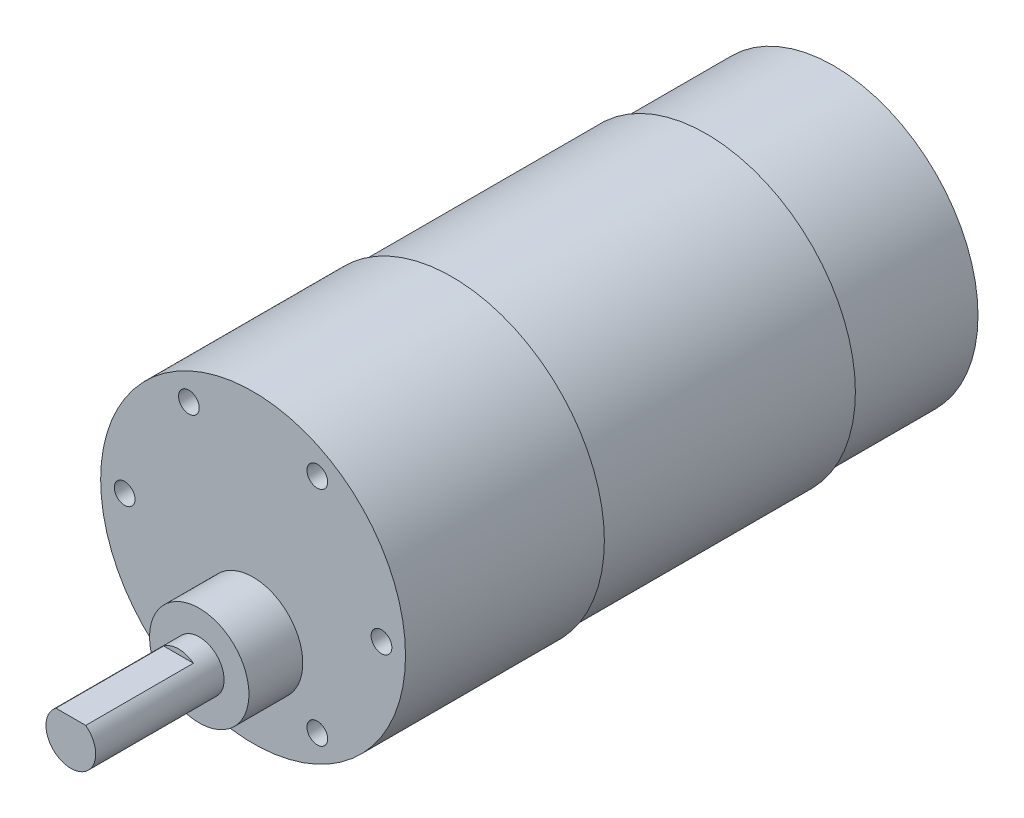
ISO-10303-21;
HEADER;
FILE_DESCRIPTION(('STEP AP214'),'2;1');
FILE_NAME('part.step','',(''),(''),'','','');
FILE_SCHEMA(('AUTOMOTIVE_DESIGN { 1 0 10303 214 1 1 1 1 }'));
ENDSEC;
DATA;
#1=APPLICATION_CONTEXT('core data for automotive mechanical design processes');
#2=APPLICATION_PROTOCOL_DEFINITION('international standard','automotive_design',2000,#1);
#3=PRODUCT_CONTEXT('',#1,'mechanical');
#4=PRODUCT('Part','Part','',(#3));
#5=PRODUCT_RELATED_PRODUCT_CATEGORY('part','',(#4));
#6=PRODUCT_DEFINITION_FORMATION('','',#4);
#7=PRODUCT_DEFINITION_CONTEXT('part definition',#1,'design');
#8=PRODUCT_DEFINITION('design','',#6,#7);
#9=PRODUCT_DEFINITION_SHAPE('','',#8);
#10=(LENGTH_UNIT() NAMED_UNIT(*) SI_UNIT(.MILLI.,.METRE.));
#11=(NAMED_UNIT(*) PLANE_ANGLE_UNIT() SI_UNIT($,.RADIAN.));
#12=(NAMED_UNIT(*) SI_UNIT($,.STERADIAN.) SOLID_ANGLE_UNIT());
#13=UNCERTAINTY_MEASURE_WITH_UNIT(LENGTH_MEASURE(1.E-05),#10,'distance_accuracy_value','');
#14=(GEOMETRIC_REPRESENTATION_CONTEXT(3) GLOBAL_UNCERTAINTY_ASSIGNED_CONTEXT((#13)) GLOBAL_UNIT_ASSIGNED_CONTEXT((#10,
#11,#12)) REPRESENTATION_CONTEXT('',''));
#15=CARTESIAN_POINT('',(0.,0.,0.));
#16=DIRECTION('',(0.,0.,1.));
#17=DIRECTION('',(1.,0.,0.));
#18=AXIS2_PLACEMENT_3D('',#15,#16,#17);
#19=CARTESIAN_POINT('',(0.,0.,15.4));
#20=DIRECTION('',(0.,0.,-1.));
#21=DIRECTION('',(-1.,0.,0.));
#22=AXIS2_PLACEMENT_3D('',#19,#20,#21);
#23=CYLINDRICAL_SURFACE('',#22,17.4);
#24=CARTESIAN_POINT('',(0.,0.,15.4));
#25=DIRECTION('',(0.,0.,1.));
#26=DIRECTION('',(1.,0.,0.));
#27=AXIS2_PLACEMENT_3D('',#24,#25,#26);
#28=CIRCLE('',#27,17.4);
#29=CARTESIAN_POINT('',(-17.4,0.,15.4));
#30=VERTEX_POINT('',#29);
#31=EDGE_CURVE('E11',#30,#30,#28,.T.);
#32=CARTESIAN_POINT('',(0.,0.,0.));
#33=DIRECTION('',(0.,0.,1.));
#34=DIRECTION('',(1.,0.,0.));
#35=AXIS2_PLACEMENT_3D('',#32,#33,#34);
#36=CIRCLE('',#35,17.4);
#37=CARTESIAN_POINT('',(-17.4,0.,0.));
#38=VERTEX_POINT('',#37);
#39=EDGE_CURVE('E36',#38,#38,#36,.T.);
#40=CARTESIAN_POINT('',(-17.4,0.,15.4));
#41=CARTESIAN_POINT('',(-17.4,0.,15.2395833333333));
#42=CARTESIAN_POINT('',(-17.4,0.,15.0791666666667));
#43=CARTESIAN_POINT('',(-17.4,0.,14.7583333333333));
#44=CARTESIAN_POINT('',(-17.4,0.,14.5979166666667));
#45=CARTESIAN_POINT('',(-17.4,0.,14.2770833333333));
#46=CARTESIAN_POINT('',(-17.4,0.,14.1166666666667));
#47=CARTESIAN_POINT('',(-17.4,0.,13.7958333333333));
#48=CARTESIAN_POINT('',(-17.4,0.,13.6354166666667));
#49=CARTESIAN_POINT('',(-17.4,0.,13.3145833333333));
#50=CARTESIAN_POINT('',(-17.4,0.,13.1541666666667));
#51=CARTESIAN_POINT('',(-17.4,0.,12.8333333333333));
#52=CARTESIAN_POINT('',(-17.4,0.,12.6729166666667));
#53=CARTESIAN_POINT('',(-17.4,0.,12.3520833333333));
#54=CARTESIAN_POINT('',(-17.4,0.,12.1916666666667));
#55=CARTESIAN_POINT('',(-17.4,0.,11.8708333333333));
#56=CARTESIAN_POINT('',(-17.4,0.,11.7104166666667));
#57=CARTESIAN_POINT('',(-17.4,0.,11.3895833333333));
#58=CARTESIAN_POINT('',(-17.4,0.,11.2291666666667));
#59=CARTESIAN_POINT('',(-17.4,0.,10.9083333333333));
#60=CARTESIAN_POINT('',(-17.4,0.,10.7479166666667));
#61=CARTESIAN_POINT('',(-17.4,0.,10.4270833333333));
#62=CARTESIAN_POINT('',(-17.4,0.,10.2666666666667));
#63=CARTESIAN_POINT('',(-17.4,0.,9.94583333333333));
#64=CARTESIAN_POINT('',(-17.4,0.,9.78541666666666));
#65=CARTESIAN_POINT('',(-17.4,0.,9.46458333333333));
#66=CARTESIAN_POINT('',(-17.4,0.,9.30416666666667));
#67=CARTESIAN_POINT('',(-17.4,0.,8.98333333333333));
#68=CARTESIAN_POINT('',(-17.4,0.,8.82291666666666));
#69=CARTESIAN_POINT('',(-17.4,0.,8.50208333333333));
#70=CARTESIAN_POINT('',(-17.4,0.,8.34166666666666));
#71=CARTESIAN_POINT('',(-17.4,0.,8.02083333333333));
#72=CARTESIAN_POINT('',(-17.4,0.,7.86041666666666));
#73=CARTESIAN_POINT('',(-17.4,0.,7.53958333333333));
#74=CARTESIAN_POINT('',(-17.4,0.,7.37916666666667));
#75=CARTESIAN_POINT('',(-17.4,0.,7.05833333333333));
#76=CARTESIAN_POINT('',(-17.4,0.,6.89791666666667));
#77=CARTESIAN_POINT('',(-17.4,0.,6.57708333333333));
#78=CARTESIAN_POINT('',(-17.4,0.,6.41666666666667));
#79=CARTESIAN_POINT('',(-17.4,0.,6.09583333333333));
#80=CARTESIAN_POINT('',(-17.4,0.,5.93541666666667));
#81=CARTESIAN_POINT('',(-17.4,0.,5.61458333333333));
#82=CARTESIAN_POINT('',(-17.4,0.,5.45416666666667));
#83=CARTESIAN_POINT('',(-17.4,0.,5.13333333333333));
#84=CARTESIAN_POINT('',(-17.4,0.,4.97291666666667));
#85=CARTESIAN_POINT('',(-17.4,0.,4.65208333333333));
#86=CARTESIAN_POINT('',(-17.4,0.,4.49166666666667));
#87=CARTESIAN_POINT('',(-17.4,0.,4.17083333333333));
#88=CARTESIAN_POINT('',(-17.4,0.,4.01041666666667));
#89=CARTESIAN_POINT('',(-17.4,0.,3.68958333333333));
#90=CARTESIAN_POINT('',(-17.4,0.,3.52916666666667));
#91=CARTESIAN_POINT('',(-17.4,0.,3.20833333333333));
#92=CARTESIAN_POINT('',(-17.4,0.,3.04791666666667));
#93=CARTESIAN_POINT('',(-17.4,0.,2.72708333333333));
#94=CARTESIAN_POINT('',(-17.4,0.,2.56666666666667));
#95=CARTESIAN_POINT('',(-17.4,0.,2.24583333333333));
#96=CARTESIAN_POINT('',(-17.4,0.,2.08541666666666));
#97=CARTESIAN_POINT('',(-17.4,0.,1.76458333333333));
#98=CARTESIAN_POINT('',(-17.4,0.,1.60416666666667));
#99=CARTESIAN_POINT('',(-17.4,0.,1.28333333333333));
#100=CARTESIAN_POINT('',(-17.4,0.,1.12291666666666));
#101=CARTESIAN_POINT('',(-17.4,0.,0.802083333333332));
#102=CARTESIAN_POINT('',(-17.4,0.,0.641666666666665));
#103=CARTESIAN_POINT('',(-17.4,0.,0.320833333333332));
#104=CARTESIAN_POINT('',(-17.4,0.,0.160416666666665));
#105=CARTESIAN_POINT('',(-17.4,0.,0.));
#106=B_SPLINE_CURVE_WITH_KNOTS('',3,(#40,#41,#42,#43,#44,#45,#46,#47,#48,#49,#50,#51,#52,#53,
#54,#55,#56,#57,#58,#59,#60,#61,#62,#63,#64,#65,#66,#67,#68,#69,#70,#71,#72,#73,#74,#75,#76,#77,
#78,#79,#80,#81,#82,#83,#84,#85,#86,#87,#88,#89,#90,#91,#92,#93,#94,#95,#96,#97,#98,#99,#100,
#101,#102,#103,#104,#105),.UNSPECIFIED.,.F.,.F.,(4,2,2,2,2,2,2,2,2,2,2,2,2,2,2,2,2,2,2,2,2,2,2,
2,2,2,2,2,2,2,2,2,4),(0.,0.481250000000001,0.962500000000002,1.44375,1.925,2.40625,2.8875,
3.36875,3.85,4.33125,4.8125,5.29375,5.775,6.25625,6.7375,7.21875,7.7,8.18125,8.6625,9.14375,
9.625,10.10625,10.5875,11.06875,11.55,12.03125,12.5125,12.99375,13.475,13.95625,14.4375,
14.91875,15.4),.UNSPECIFIED.);
#107=EDGE_CURVE('BSEAM33',#30,#38,#106,.T.);
#108=ORIENTED_EDGE('',*,*,#31,.F.);
#109=ORIENTED_EDGE('',*,*,#39,.T.);
#110=ORIENTED_EDGE('',*,*,#107,.T.);
#111=ORIENTED_EDGE('',*,*,#107,.F.);
#112=EDGE_LOOP('',(#108,#110,#109,#111));
#113=FACE_BOUND('',#112,.T.);
#114=ADVANCED_FACE('F33',(#113),#23,.T.);
#115=CARTESIAN_POINT('',(0.,0.,0.));
#116=DIRECTION('',(0.,0.,1.));
#117=DIRECTION('',(1.,0.,0.));
#118=AXIS2_PLACEMENT_3D('',#115,#116,#117);
#119=PLANE('',#118);
#120=ORIENTED_EDGE('',*,*,#39,.F.);
#121=EDGE_LOOP('',(#120));
#122=FACE_BOUND('',#121,.T.);
#123=ADVANCED_FACE('F112',(#122),#119,.F.);
#124=CARTESIAN_POINT('',(0.,0.,46.1));
#125=DIRECTION('',(0.,0.,-1.));
#126=DIRECTION('',(-1.,0.,0.));
#127=AXIS2_PLACEMENT_3D('',#124,#125,#126);
#128=CYLINDRICAL_SURFACE('',#127,18.);
#129=CARTESIAN_POINT('',(0.,0.,46.1));
#130=DIRECTION('',(0.,0.,1.));
#131=DIRECTION('',(1.,0.,0.));
#132=AXIS2_PLACEMENT_3D('',#129,#130,#131);
#133=CIRCLE('',#132,18.);
#134=CARTESIAN_POINT('',(18.,0.,46.1));
#135=VERTEX_POINT('',#134);
#136=EDGE_CURVE('E92',#135,#135,#133,.T.);
#137=ORIENTED_EDGE('',*,*,#136,.F.);
#138=EDGE_LOOP('',(#137));
#139=FACE_BOUND('',#138,.T.);
#140=CARTESIAN_POINT('',(0.,0.,15.4));
#141=DIRECTION('',(0.,0.,1.));
#142=DIRECTION('',(1.,0.,0.));
#143=AXIS2_PLACEMENT_3D('',#140,#141,#142);
#144=CIRCLE('',#143,18.);
#145=CARTESIAN_POINT('',(18.,0.,15.4));
#146=VERTEX_POINT('',#145);
#147=EDGE_CURVE('E89',#146,#146,#144,.T.);
#148=ORIENTED_EDGE('',*,*,#147,.T.);
#149=EDGE_LOOP('',(#148));
#150=FACE_BOUND('',#149,.T.);
#151=ADVANCED_FACE('F98',(#139,#150),#128,.T.);
#152=CARTESIAN_POINT('',(0.,0.,15.4));
#153=DIRECTION('',(0.,0.,1.));
#154=DIRECTION('',(1.,0.,0.));
#155=AXIS2_PLACEMENT_3D('',#152,#153,#154);
#156=PLANE('',#155);
#157=ORIENTED_EDGE('',*,*,#31,.T.);
#158=EDGE_LOOP('',(#157));
#159=FACE_BOUND('',#158,.T.);
#160=ORIENTED_EDGE('',*,*,#147,.F.);
#161=EDGE_LOOP('',(#160));
#162=FACE_BOUND('',#161,.T.);
#163=ADVANCED_FACE('F100',(#159,#162),#156,.F.);
#164=CARTESIAN_POINT('',(0.,0.,70.1));
#165=DIRECTION('',(0.,0.,-1.));
#166=DIRECTION('',(-1.,0.,0.));
#167=AXIS2_PLACEMENT_3D('',#164,#165,#166);
#168=CYLINDRICAL_SURFACE('',#167,18.4);
#169=CARTESIAN_POINT('',(0.,0.,70.1));
#170=DIRECTION('',(0.,0.,1.));
#171=DIRECTION('',(1.,0.,0.));
#172=AXIS2_PLACEMENT_3D('',#169,#170,#171);
#173=CIRCLE('',#172,18.4);
#174=CARTESIAN_POINT('',(18.4,0.,70.1));
#175=VERTEX_POINT('',#174);
#176=EDGE_CURVE('E86',#175,#175,#173,.T.);
#177=ORIENTED_EDGE('',*,*,#176,.F.);
#178=EDGE_LOOP('',(#177));
#179=FACE_BOUND('',#178,.T.);
#180=CARTESIAN_POINT('',(0.,0.,46.1));
#181=DIRECTION('',(0.,0.,1.));
#182=DIRECTION('',(1.,0.,0.));
#183=AXIS2_PLACEMENT_3D('',#180,#181,#182);
#184=CIRCLE('',#183,18.4);
#185=CARTESIAN_POINT('',(18.4,0.,46.1));
#186=VERTEX_POINT('',#185);
#187=EDGE_CURVE('E84',#186,#186,#184,.T.);
#188=ORIENTED_EDGE('',*,*,#187,.T.);
#189=EDGE_LOOP('',(#188));
#190=FACE_BOUND('',#189,.T.);
#191=ADVANCED_FACE('F102',(#179,#190),#168,.T.);
#192=CARTESIAN_POINT('',(0.,0.,70.1));
#193=DIRECTION('',(0.,0.,1.));
#194=DIRECTION('',(1.,0.,0.));
#195=AXIS2_PLACEMENT_3D('',#192,#193,#194);
#196=PLANE('',#195);
#197=CARTESIAN_POINT('',(-15.5,0.,70.1));
#198=DIRECTION('',(0.,0.,1.));
#199=DIRECTION('',(1.,0.,0.));
#200=AXIS2_PLACEMENT_3D('',#197,#198,#199);
#201=CIRCLE('',#200,1.25);
#202=CARTESIAN_POINT('',(-14.25,0.,70.1));
#203=VERTEX_POINT('',#202);
#204=EDGE_CURVE('E344',#203,#203,#201,.T.);
#205=ORIENTED_EDGE('',*,*,#204,.F.);
#206=EDGE_LOOP('',(#205));
#207=FACE_BOUND('',#206,.T.);
#208=CARTESIAN_POINT('',(-7.74999999999997,13.4233937586588,70.1));
#209=DIRECTION('',(0.,0.,1.));
#210=DIRECTION('',(1.,0.,0.));
#211=AXIS2_PLACEMENT_3D('',#208,#209,#210);
#212=CIRCLE('',#211,1.25);
#213=CARTESIAN_POINT('',(-6.49999999999997,13.4233937586588,70.1));
#214=VERTEX_POINT('',#213);
#215=EDGE_CURVE('E346',#214,#214,#212,.T.);
#216=ORIENTED_EDGE('',*,*,#215,.F.);
#217=EDGE_LOOP('',(#216));
#218=FACE_BOUND('',#217,.T.);
#219=CARTESIAN_POINT('',(7.75000000000006,13.4233937586588,70.1));
#220=DIRECTION('',(0.,0.,1.));
#221=DIRECTION('',(1.,0.,0.));
#222=AXIS2_PLACEMENT_3D('',#219,#220,#221);
#223=CIRCLE('',#222,1.25);
#224=CARTESIAN_POINT('',(9.00000000000006,13.4233937586588,70.1));
#225=VERTEX_POINT('',#224);
#226=EDGE_CURVE('E354',#225,#225,#223,.T.);
#227=ORIENTED_EDGE('',*,*,#226,.F.);
#228=EDGE_LOOP('',(#227));
#229=FACE_BOUND('',#228,.T.);
#230=CARTESIAN_POINT('',(15.5,-1.08235921504137E-13,70.1));
#231=DIRECTION('',(0.,0.,1.));
#232=DIRECTION('',(1.,0.,0.));
#233=AXIS2_PLACEMENT_3D('',#230,#231,#232);
#234=CIRCLE('',#233,1.25);
#235=CARTESIAN_POINT('',(16.75,-1.08235921504137E-13,70.1));
#236=VERTEX_POINT('',#235);
#237=EDGE_CURVE('E360',#236,#236,#234,.T.);
#238=ORIENTED_EDGE('',*,*,#237,.F.);
#239=EDGE_LOOP('',(#238));
#240=FACE_BOUND('',#239,.T.);
#241=CARTESIAN_POINT('',(7.74999999999987,-13.4233937586589,70.1));
#242=DIRECTION('',(0.,0.,1.));
#243=DIRECTION('',(1.,0.,0.));
#244=AXIS2_PLACEMENT_3D('',#241,#242,#243);
#245=CIRCLE('',#244,1.25);
#246=CARTESIAN_POINT('',(8.99999999999987,-13.4233937586589,70.1));
#247=VERTEX_POINT('',#246);
#248=EDGE_CURVE('E366',#247,#247,#245,.T.);
#249=ORIENTED_EDGE('',*,*,#248,.F.);
#250=EDGE_LOOP('',(#249));
#251=FACE_BOUND('',#250,.T.);
#252=CARTESIAN_POINT('',(-7.75000000000016,-13.4233937586587,70.1));
#253=DIRECTION('',(0.,0.,1.));
#254=DIRECTION('',(1.,0.,0.));
#255=AXIS2_PLACEMENT_3D('',#252,#253,#254);
#256=CIRCLE('',#255,1.25);
#257=CARTESIAN_POINT('',(-6.50000000000016,-13.4233937586587,70.1));
#258=VERTEX_POINT('',#257);
#259=EDGE_CURVE('E372',#258,#258,#256,.T.);
#260=ORIENTED_EDGE('',*,*,#259,.F.);
#261=EDGE_LOOP('',(#260));
#262=FACE_BOUND('',#261,.T.);
#263=CARTESIAN_POINT('',(0.,-7.,70.1));
#264=DIRECTION('',(0.,0.,1.));
#265=DIRECTION('',(1.,0.,0.));
#266=AXIS2_PLACEMENT_3D('',#263,#264,#265);
#267=CIRCLE('',#266,6.);
#268=CARTESIAN_POINT('',(-6.,-7.,70.1));
#269=VERTEX_POINT('',#268);
#270=EDGE_CURVE('E74',#269,#269,#267,.T.);
#271=ORIENTED_EDGE('',*,*,#270,.F.);
#272=EDGE_LOOP('',(#271));
#273=FACE_BOUND('',#272,.T.);
#274=ORIENTED_EDGE('',*,*,#176,.T.);
#275=EDGE_LOOP('',(#274));
#276=FACE_BOUND('',#275,.T.);
#277=ADVANCED_FACE('F109',(#207,#218,#229,#240,#251,#262,#273,#276),#196,.T.);
#278=CARTESIAN_POINT('',(0.,0.,46.1));
#279=DIRECTION('',(0.,0.,1.));
#280=DIRECTION('',(1.,0.,0.));
#281=AXIS2_PLACEMENT_3D('',#278,#279,#280);
#282=PLANE('',#281);
#283=ORIENTED_EDGE('',*,*,#136,.T.);
#284=EDGE_LOOP('',(#283));
#285=FACE_BOUND('',#284,.T.);
#286=ORIENTED_EDGE('',*,*,#187,.F.);
#287=EDGE_LOOP('',(#286));
#288=FACE_BOUND('',#287,.T.);
#289=ADVANCED_FACE('F148',(#285,#288),#282,.F.);
#290=CARTESIAN_POINT('',(0.,-7.,76.6));
#291=DIRECTION('',(0.,0.,-1.));
#292=DIRECTION('',(-1.,0.,0.));
#293=AXIS2_PLACEMENT_3D('',#290,#291,#292);
#294=CYLINDRICAL_SURFACE('',#293,6.);
#295=CARTESIAN_POINT('',(0.,-7.,76.6));
#296=DIRECTION('',(0.,0.,1.));
#297=DIRECTION('',(1.,0.,0.));
#298=AXIS2_PLACEMENT_3D('',#295,#296,#297);
#299=CIRCLE('',#298,6.);
#300=CARTESIAN_POINT('',(-6.,-7.,76.6));
#301=VERTEX_POINT('',#300);
#302=EDGE_CURVE('E77',#301,#301,#299,.T.);
#303=CARTESIAN_POINT('',(-6.,-7.,76.6));
#304=CARTESIAN_POINT('',(-6.,-7.,76.5322916666667));
#305=CARTESIAN_POINT('',(-6.,-7.,76.4645833333333));
#306=CARTESIAN_POINT('',(-6.,-7.,76.3291666666667));
#307=CARTESIAN_POINT('',(-6.,-7.,76.2614583333333));
#308=CARTESIAN_POINT('',(-6.,-7.,76.1260416666667));
#309=CARTESIAN_POINT('',(-6.,-7.,76.0583333333333));
#310=CARTESIAN_POINT('',(-6.,-7.,75.9229166666667));
#311=CARTESIAN_POINT('',(-6.,-7.,75.8552083333333));
#312=CARTESIAN_POINT('',(-6.,-7.,75.7197916666667));
#313=CARTESIAN_POINT('',(-6.,-7.,75.6520833333333));
#314=CARTESIAN_POINT('',(-6.,-7.,75.5166666666667));
#315=CARTESIAN_POINT('',(-6.,-7.,75.4489583333333));
#316=CARTESIAN_POINT('',(-6.,-7.,75.3135416666667));
#317=CARTESIAN_POINT('',(-6.,-7.,75.2458333333333));
#318=CARTESIAN_POINT('',(-6.,-7.,75.1104166666667));
#319=CARTESIAN_POINT('',(-6.,-7.,75.0427083333333));
#320=CARTESIAN_POINT('',(-6.,-7.,74.9072916666667));
#321=CARTESIAN_POINT('',(-6.,-7.,74.8395833333333));
#322=CARTESIAN_POINT('',(-6.,-7.,74.7041666666667));
#323=CARTESIAN_POINT('',(-6.,-7.,74.6364583333333));
#324=CARTESIAN_POINT('',(-6.,-7.,74.5010416666667));
#325=CARTESIAN_POINT('',(-6.,-7.,74.4333333333333));
#326=CARTESIAN_POINT('',(-6.,-7.,74.2979166666667));
#327=CARTESIAN_POINT('',(-6.,-7.,74.2302083333333));
#328=CARTESIAN_POINT('',(-6.,-7.,74.0947916666667));
#329=CARTESIAN_POINT('',(-6.,-7.,74.0270833333333));
#330=CARTESIAN_POINT('',(-6.,-7.,73.8916666666667));
#331=CARTESIAN_POINT('',(-6.,-7.,73.8239583333333));
#332=CARTESIAN_POINT('',(-6.,-7.,73.6885416666667));
#333=CARTESIAN_POINT('',(-6.,-7.,73.6208333333333));
#334=CARTESIAN_POINT('',(-6.,-7.,73.4854166666667));
#335=CARTESIAN_POINT('',(-6.,-7.,73.4177083333333));
#336=CARTESIAN_POINT('',(-6.,-7.,73.2822916666667));
#337=CARTESIAN_POINT('',(-6.,-7.,73.2145833333333));
#338=CARTESIAN_POINT('',(-6.,-7.,73.0791666666667));
#339=CARTESIAN_POINT('',(-6.,-7.,73.0114583333333));
#340=CARTESIAN_POINT('',(-6.,-7.,72.8760416666667));
#341=CARTESIAN_POINT('',(-6.,-7.,72.8083333333333));
#342=CARTESIAN_POINT('',(-6.,-7.,72.6729166666667));
#343=CARTESIAN_POINT('',(-6.,-7.,72.6052083333333));
#344=CARTESIAN_POINT('',(-6.,-7.,72.4697916666667));
#345=CARTESIAN_POINT('',(-6.,-7.,72.4020833333333));
#346=CARTESIAN_POINT('',(-6.,-7.,72.2666666666667));
#347=CARTESIAN_POINT('',(-6.,-7.,72.1989583333333));
#348=CARTESIAN_POINT('',(-6.,-7.,72.0635416666667));
#349=CARTESIAN_POINT('',(-6.,-7.,71.9958333333333));
#350=CARTESIAN_POINT('',(-6.,-7.,71.8604166666667));
#351=CARTESIAN_POINT('',(-6.,-7.,71.7927083333333));
#352=CARTESIAN_POINT('',(-6.,-7.,71.6572916666667));
#353=CARTESIAN_POINT('',(-6.,-7.,71.5895833333333));
#354=CARTESIAN_POINT('',(-6.,-7.,71.4541666666667));
#355=CARTESIAN_POINT('',(-6.,-7.,71.3864583333333));
#356=CARTESIAN_POINT('',(-6.,-7.,71.2510416666667));
#357=CARTESIAN_POINT('',(-6.,-7.,71.1833333333333));
#358=CARTESIAN_POINT('',(-6.,-7.,71.0479166666667));
#359=CARTESIAN_POINT('',(-6.,-7.,70.9802083333333));
#360=CARTESIAN_POINT('',(-6.,-7.,70.8447916666667));
#361=CARTESIAN_POINT('',(-6.,-7.,70.7770833333333));
#362=CARTESIAN_POINT('',(-6.,-7.,70.6416666666667));
#363=CARTESIAN_POINT('',(-6.,-7.,70.5739583333333));
#364=CARTESIAN_POINT('',(-6.,-7.,70.4385416666667));
#365=CARTESIAN_POINT('',(-6.,-7.,70.3708333333333));
#366=CARTESIAN_POINT('',(-6.,-7.,70.2354166666667));
#367=CARTESIAN_POINT('',(-6.,-7.,70.1677083333333));
#368=CARTESIAN_POINT('',(-6.,-7.,70.1));
#369=B_SPLINE_CURVE_WITH_KNOTS('',3,(#303,#304,#305,#306,#307,#308,#309,#310,#311,#312,#313,
#314,#315,#316,#317,#318,#319,#320,#321,#322,#323,#324,#325,#326,#327,#328,#329,#330,#331,#332,
#333,#334,#335,#336,#337,#338,#339,#340,#341,#342,#343,#344,#345,#346,#347,#348,#349,#350,#351,
#352,#353,#354,#355,#356,#357,#358,#359,#360,#361,#362,#363,#364,#365,#366,#367,#368),
.UNSPECIFIED.,.F.,.F.,(4,2,2,2,2,2,2,2,2,2,2,2,2,2,2,2,2,2,2,2,2,2,2,2,2,2,2,2,2,2,2,2,4),(0.,
0.203124999999998,0.406249999999997,0.609374999999995,0.812499999999994,1.01562499999999,
1.21874999999999,1.42187499999999,1.625,1.828125,2.03125,2.234375,2.4375,2.64062499999999,
2.84374999999999,3.04687499999999,3.25,3.453125,3.65625,3.859375,4.0625,4.26562499999999,
4.46874999999999,4.67187499999999,4.875,5.078125,5.28125,5.484375,5.6875,5.890625,
6.09374999999999,6.29687499999999,6.50000000000001),.UNSPECIFIED.);
#370=EDGE_CURVE('BSEAM153',#301,#269,#369,.T.);
#371=ORIENTED_EDGE('',*,*,#302,.F.);
#372=ORIENTED_EDGE('',*,*,#270,.T.);
#373=ORIENTED_EDGE('',*,*,#370,.T.);
#374=ORIENTED_EDGE('',*,*,#370,.F.);
#375=EDGE_LOOP('',(#371,#373,#372,#374));
#376=FACE_BOUND('',#375,.T.);
#377=ADVANCED_FACE('F153',(#376),#294,.T.);
#378=CARTESIAN_POINT('',(0.,-7.,76.6));
#379=DIRECTION('',(0.,0.,1.));
#380=DIRECTION('',(1.,0.,0.));
#381=AXIS2_PLACEMENT_3D('',#378,#379,#380);
#382=PLANE('',#381);
#383=CARTESIAN_POINT('',(0.,-7.,76.6));
#384=DIRECTION('',(0.,0.,1.));
#385=DIRECTION('',(1.,0.,0.));
#386=AXIS2_PLACEMENT_3D('',#383,#384,#385);
#387=CIRCLE('',#386,3.);
#388=CARTESIAN_POINT('',(3.,-7.,76.6));
#389=VERTEX_POINT('',#388);
#390=EDGE_CURVE('E71',#389,#389,#387,.T.);
#391=ORIENTED_EDGE('',*,*,#390,.F.);
#392=EDGE_LOOP('',(#391));
#393=FACE_BOUND('',#392,.T.);
#394=ORIENTED_EDGE('',*,*,#302,.T.);
#395=EDGE_LOOP('',(#394));
#396=FACE_BOUND('',#395,.T.);
#397=ADVANCED_FACE('F163',(#393,#396),#382,.T.);
#398=CARTESIAN_POINT('',(0.,-7.,92.1));
#399=DIRECTION('',(0.,0.,-1.));
#400=DIRECTION('',(-1.,0.,0.));
#401=AXIS2_PLACEMENT_3D('',#398,#399,#400);
#402=CYLINDRICAL_SURFACE('',#401,3.);
#403=CARTESIAN_POINT('',(0.,-7.,92.1));
#404=DIRECTION('',(0.,0.,1.));
#405=DIRECTION('',(1.,0.,0.));
#406=AXIS2_PLACEMENT_3D('',#403,#404,#405);
#407=CIRCLE('',#406,3.);
#408=CARTESIAN_POINT('',(-1.8,-4.6,92.1));
#409=VERTEX_POINT('',#408);
#410=CARTESIAN_POINT('',(1.8,-4.6,92.1));
#411=VERTEX_POINT('',#410);
#412=EDGE_CURVE('E70',#409,#411,#407,.T.);
#413=ORIENTED_EDGE('',*,*,#412,.F.);
#414=DIRECTION('',(0.,0.,1.));
#415=VECTOR('',#414,1.);
#416=CARTESIAN_POINT('',(-1.8,-4.6,79.1));
#417=LINE('',#416,#415);
#418=CARTESIAN_POINT('',(-1.8,-4.6,79.1));
#419=VERTEX_POINT('',#418);
#420=EDGE_CURVE('E47',#419,#409,#417,.T.);
#421=ORIENTED_EDGE('',*,*,#420,.F.);
#422=CARTESIAN_POINT('',(0.,-7.00000000000001,79.1));
#423=DIRECTION('',(0.,0.,1.));
#424=DIRECTION('',(-1.,0.,0.));
#425=AXIS2_PLACEMENT_3D('',#422,#423,#424);
#426=CIRCLE('',#425,3.00000000000001);
#427=CARTESIAN_POINT('',(1.8,-4.6,79.1));
#428=VERTEX_POINT('',#427);
#429=EDGE_CURVE('E63',#428,#419,#426,.T.);
#430=ORIENTED_EDGE('',*,*,#429,.F.);
#431=DIRECTION('',(0.,0.,1.));
#432=VECTOR('',#431,1.);
#433=CARTESIAN_POINT('',(1.8,-4.6,79.1));
#434=LINE('',#433,#432);
#435=EDGE_CURVE('E53',#428,#411,#434,.T.);
#436=ORIENTED_EDGE('',*,*,#435,.T.);
#437=EDGE_LOOP('',(#413,#421,#430,#436));
#438=FACE_BOUND('',#437,.T.);
#439=ORIENTED_EDGE('',*,*,#390,.T.);
#440=EDGE_LOOP('',(#439));
#441=FACE_BOUND('',#440,.T.);
#442=ADVANCED_FACE('F68',(#438,#441),#402,.T.);
#443=CARTESIAN_POINT('',(0.,-7.,92.1));
#444=DIRECTION('',(0.,0.,1.));
#445=DIRECTION('',(1.,0.,0.));
#446=AXIS2_PLACEMENT_3D('',#443,#444,#445);
#447=PLANE('',#446);
#448=DIRECTION('',(1.,0.,0.));
#449=VECTOR('',#448,1.);
#450=CARTESIAN_POINT('',(-1.8,-4.6,92.1));
#451=LINE('',#450,#449);
#452=EDGE_CURVE('E58',#409,#411,#451,.T.);
#453=ORIENTED_EDGE('',*,*,#452,.F.);
#454=ORIENTED_EDGE('',*,*,#412,.T.);
#455=EDGE_LOOP('',(#453,#454));
#456=FACE_BOUND('',#455,.T.);
#457=ADVANCED_FACE('F73',(#456),#447,.T.);
#458=CARTESIAN_POINT('',(-1.8,-4.6,79.1));
#459=DIRECTION('',(0.,-1.,0.));
#460=DIRECTION('',(0.,0.,-1.));
#461=AXIS2_PLACEMENT_3D('',#458,#459,#460);
#462=PLANE('',#461);
#463=ORIENTED_EDGE('',*,*,#452,.T.);
#464=ORIENTED_EDGE('',*,*,#435,.F.);
#465=DIRECTION('',(1.,0.,0.));
#466=VECTOR('',#465,1.);
#467=CARTESIAN_POINT('',(-1.8,-4.6,79.1));
#468=LINE('',#467,#466);
#469=EDGE_CURVE('E378',#419,#428,#468,.T.);
#470=ORIENTED_EDGE('',*,*,#469,.F.);
#471=ORIENTED_EDGE('',*,*,#420,.T.);
#472=EDGE_LOOP('',(#463,#464,#470,#471));
#473=FACE_BOUND('',#472,.T.);
#474=ADVANCED_FACE('F59',(#473),#462,.F.);
#475=CARTESIAN_POINT('',(0.,-7.00000000000001,79.1));
#476=DIRECTION('',(0.,0.,-1.));
#477=DIRECTION('',(-1.,0.,0.));
#478=AXIS2_PLACEMENT_3D('',#475,#476,#477);
#479=PLANE('',#478);
#480=ORIENTED_EDGE('',*,*,#429,.T.);
#481=ORIENTED_EDGE('',*,*,#469,.T.);
#482=EDGE_LOOP('',(#480,#481));
#483=FACE_BOUND('',#482,.T.);
#484=ADVANCED_FACE('F198',(#483),#479,.F.);
#485=CARTESIAN_POINT('',(-7.75000000000016,-13.4233937586587,59.34));
#486=DIRECTION('',(0.,0.,-1.));
#487=DIRECTION('',(-1.,0.,0.));
#488=AXIS2_PLACEMENT_3D('',#485,#486,#487);
#489=PLANE('',#488);
#490=CARTESIAN_POINT('',(-7.75000000000016,-13.4233937586587,59.34));
#491=DIRECTION('',(0.,0.,1.));
#492=DIRECTION('',(1.,0.,0.));
#493=AXIS2_PLACEMENT_3D('',#490,#491,#492);
#494=CIRCLE('',#493,1.25);
#495=CARTESIAN_POINT('',(-6.50000000000016,-13.4233937586587,59.34));
#496=VERTEX_POINT('',#495);
#497=EDGE_CURVE('E64',#496,#496,#494,.T.);
#498=ORIENTED_EDGE('',*,*,#497,.T.);
#499=EDGE_LOOP('',(#498));
#500=FACE_BOUND('',#499,.T.);
#501=ADVANCED_FACE('F207',(#500),#489,.F.);
#502=CARTESIAN_POINT('',(-7.75000000000016,-13.4233937586587,70.1));
#503=DIRECTION('',(0.,0.,1.));
#504=DIRECTION('',(1.,0.,0.));
#505=AXIS2_PLACEMENT_3D('',#502,#503,#504);
#506=CYLINDRICAL_SURFACE('',#505,1.25);
#507=ORIENTED_EDGE('',*,*,#497,.F.);
#508=EDGE_LOOP('',(#507));
#509=FACE_BOUND('',#508,.T.);
#510=ORIENTED_EDGE('',*,*,#259,.T.);
#511=EDGE_LOOP('',(#510));
#512=FACE_BOUND('',#511,.T.);
#513=ADVANCED_FACE('F224',(#509,#512),#506,.F.);
#514=CARTESIAN_POINT('',(7.74999999999987,-13.4233937586589,59.34));
#515=DIRECTION('',(0.,0.,-1.));
#516=DIRECTION('',(-1.,0.,0.));
#517=AXIS2_PLACEMENT_3D('',#514,#515,#516);
#518=PLANE('',#517);
#519=CARTESIAN_POINT('',(7.74999999999987,-13.4233937586589,59.34));
#520=DIRECTION('',(0.,0.,1.));
#521=DIRECTION('',(1.,0.,0.));
#522=AXIS2_PLACEMENT_3D('',#519,#520,#521);
#523=CIRCLE('',#522,1.25);
#524=CARTESIAN_POINT('',(8.99999999999987,-13.4233937586589,59.34));
#525=VERTEX_POINT('',#524);
#526=EDGE_CURVE('E369',#525,#525,#523,.T.);
#527=ORIENTED_EDGE('',*,*,#526,.T.);
#528=EDGE_LOOP('',(#527));
#529=FACE_BOUND('',#528,.T.);
#530=ADVANCED_FACE('F234',(#529),#518,.F.);
#531=CARTESIAN_POINT('',(7.74999999999987,-13.4233937586589,70.1));
#532=DIRECTION('',(0.,0.,1.));
#533=DIRECTION('',(1.,0.,0.));
#534=AXIS2_PLACEMENT_3D('',#531,#532,#533);
#535=CYLINDRICAL_SURFACE('',#534,1.25);
#536=ORIENTED_EDGE('',*,*,#526,.F.);
#537=EDGE_LOOP('',(#536));
#538=FACE_BOUND('',#537,.T.);
#539=ORIENTED_EDGE('',*,*,#248,.T.);
#540=EDGE_LOOP('',(#539));
#541=FACE_BOUND('',#540,.T.);
#542=ADVANCED_FACE('F244',(#538,#541),#535,.F.);
#543=CARTESIAN_POINT('',(15.5,-1.08235921504137E-13,59.34));
#544=DIRECTION('',(0.,0.,-1.));
#545=DIRECTION('',(-1.,0.,0.));
#546=AXIS2_PLACEMENT_3D('',#543,#544,#545);
#547=PLANE('',#546);
#548=CARTESIAN_POINT('',(15.5,-1.08235921504137E-13,59.34));
#549=DIRECTION('',(0.,0.,1.));
#550=DIRECTION('',(1.,0.,0.));
#551=AXIS2_PLACEMENT_3D('',#548,#549,#550);
#552=CIRCLE('',#551,1.25);
#553=CARTESIAN_POINT('',(16.75,-1.08235921504137E-13,59.34));
#554=VERTEX_POINT('',#553);
#555=EDGE_CURVE('E363',#554,#554,#552,.T.);
#556=ORIENTED_EDGE('',*,*,#555,.T.);
#557=EDGE_LOOP('',(#556));
#558=FACE_BOUND('',#557,.T.);
#559=ADVANCED_FACE('F254',(#558),#547,.F.);
#560=CARTESIAN_POINT('',(15.5,-1.08235921504137E-13,70.1));
#561=DIRECTION('',(0.,0.,1.));
#562=DIRECTION('',(1.,0.,0.));
#563=AXIS2_PLACEMENT_3D('',#560,#561,#562);
#564=CYLINDRICAL_SURFACE('',#563,1.25);
#565=ORIENTED_EDGE('',*,*,#555,.F.);
#566=EDGE_LOOP('',(#565));
#567=FACE_BOUND('',#566,.T.);
#568=ORIENTED_EDGE('',*,*,#237,.T.);
#569=EDGE_LOOP('',(#568));
#570=FACE_BOUND('',#569,.T.);
#571=ADVANCED_FACE('F264',(#567,#570),#564,.F.);
#572=CARTESIAN_POINT('',(7.75000000000006,13.4233937586588,59.34));
#573=DIRECTION('',(0.,0.,-1.));
#574=DIRECTION('',(-1.,0.,0.));
#575=AXIS2_PLACEMENT_3D('',#572,#573,#574);
#576=PLANE('',#575);
#577=CARTESIAN_POINT('',(7.75000000000006,13.4233937586588,59.34));
#578=DIRECTION('',(0.,0.,1.));
#579=DIRECTION('',(1.,0.,0.));
#580=AXIS2_PLACEMENT_3D('',#577,#578,#579);
#581=CIRCLE('',#580,1.25);
#582=CARTESIAN_POINT('',(9.00000000000006,13.4233937586588,59.34));
#583=VERTEX_POINT('',#582);
#584=EDGE_CURVE('E357',#583,#583,#581,.T.);
#585=ORIENTED_EDGE('',*,*,#584,.T.);
#586=EDGE_LOOP('',(#585));
#587=FACE_BOUND('',#586,.T.);
#588=ADVANCED_FACE('F274',(#587),#576,.F.);
#589=CARTESIAN_POINT('',(7.75000000000006,13.4233937586588,70.1));
#590=DIRECTION('',(0.,0.,1.));
#591=DIRECTION('',(1.,0.,0.));
#592=AXIS2_PLACEMENT_3D('',#589,#590,#591);
#593=CYLINDRICAL_SURFACE('',#592,1.25);
#594=ORIENTED_EDGE('',*,*,#584,.F.);
#595=EDGE_LOOP('',(#594));
#596=FACE_BOUND('',#595,.T.);
#597=ORIENTED_EDGE('',*,*,#226,.T.);
#598=EDGE_LOOP('',(#597));
#599=FACE_BOUND('',#598,.T.);
#600=ADVANCED_FACE('F284',(#596,#599),#593,.F.);
#601=CARTESIAN_POINT('',(-7.74999999999997,13.4233937586588,59.34));
#602=DIRECTION('',(0.,0.,-1.));
#603=DIRECTION('',(-1.,0.,0.));
#604=AXIS2_PLACEMENT_3D('',#601,#602,#603);
#605=PLANE('',#604);
#606=CARTESIAN_POINT('',(-7.74999999999997,13.4233937586588,59.34));
#607=DIRECTION('',(0.,0.,1.));
#608=DIRECTION('',(1.,0.,0.));
#609=AXIS2_PLACEMENT_3D('',#606,#607,#608);
#610=CIRCLE('',#609,1.25);
#611=CARTESIAN_POINT('',(-6.49999999999997,13.4233937586588,59.34));
#612=VERTEX_POINT('',#611);
#613=EDGE_CURVE('E351',#612,#612,#610,.T.);
#614=ORIENTED_EDGE('',*,*,#613,.T.);
#615=EDGE_LOOP('',(#614));
#616=FACE_BOUND('',#615,.T.);
#617=ADVANCED_FACE('F294',(#616),#605,.F.);
#618=CARTESIAN_POINT('',(-7.74999999999997,13.4233937586588,70.1));
#619=DIRECTION('',(0.,0.,1.));
#620=DIRECTION('',(1.,0.,0.));
#621=AXIS2_PLACEMENT_3D('',#618,#619,#620);
#622=CYLINDRICAL_SURFACE('',#621,1.25);
#623=ORIENTED_EDGE('',*,*,#613,.F.);
#624=EDGE_LOOP('',(#623));
#625=FACE_BOUND('',#624,.T.);
#626=ORIENTED_EDGE('',*,*,#215,.T.);
#627=EDGE_LOOP('',(#626));
#628=FACE_BOUND('',#627,.T.);
#629=ADVANCED_FACE('F304',(#625,#628),#622,.F.);
#630=CARTESIAN_POINT('',(-15.5,0.,59.34));
#631=DIRECTION('',(0.,0.,-1.));
#632=DIRECTION('',(-1.,0.,0.));
#633=AXIS2_PLACEMENT_3D('',#630,#631,#632);
#634=PLANE('',#633);
#635=CARTESIAN_POINT('',(-15.5,0.,59.34));
#636=DIRECTION('',(0.,0.,1.));
#637=DIRECTION('',(1.,0.,0.));
#638=AXIS2_PLACEMENT_3D('',#635,#636,#637);
#639=CIRCLE('',#638,1.25);
#640=CARTESIAN_POINT('',(-14.25,0.,59.34));
#641=VERTEX_POINT('',#640);
#642=EDGE_CURVE('E341',#641,#641,#639,.T.);
#643=ORIENTED_EDGE('',*,*,#642,.T.);
#644=EDGE_LOOP('',(#643));
#645=FACE_BOUND('',#644,.T.);
#646=ADVANCED_FACE('F314',(#645),#634,.F.);
#647=CARTESIAN_POINT('',(-15.5,0.,70.1));
#648=DIRECTION('',(0.,0.,1.));
#649=DIRECTION('',(1.,0.,0.));
#650=AXIS2_PLACEMENT_3D('',#647,#648,#649);
#651=CYLINDRICAL_SURFACE('',#650,1.25);
#652=ORIENTED_EDGE('',*,*,#642,.F.);
#653=EDGE_LOOP('',(#652));
#654=FACE_BOUND('',#653,.T.);
#655=ORIENTED_EDGE('',*,*,#204,.T.);
#656=EDGE_LOOP('',(#655));
#657=FACE_BOUND('',#656,.T.);
#658=ADVANCED_FACE('F324',(#654,#657),#651,.F.);
#659=CLOSED_SHELL('',(#114,#123,#151,#163,#191,#277,#289,#377,#397,#442,#457,#474,#484,#501,
#513,#530,#542,#559,#571,#588,#600,#617,#629,#646,#658));
#660=MANIFOLD_SOLID_BREP('B2',#659);
#661=ADVANCED_BREP_SHAPE_REPRESENTATION('',(#18,#660),#14);
#662=SHAPE_DEFINITION_REPRESENTATION(#9,#661);
ENDSEC;
END-ISO-10303-21;
